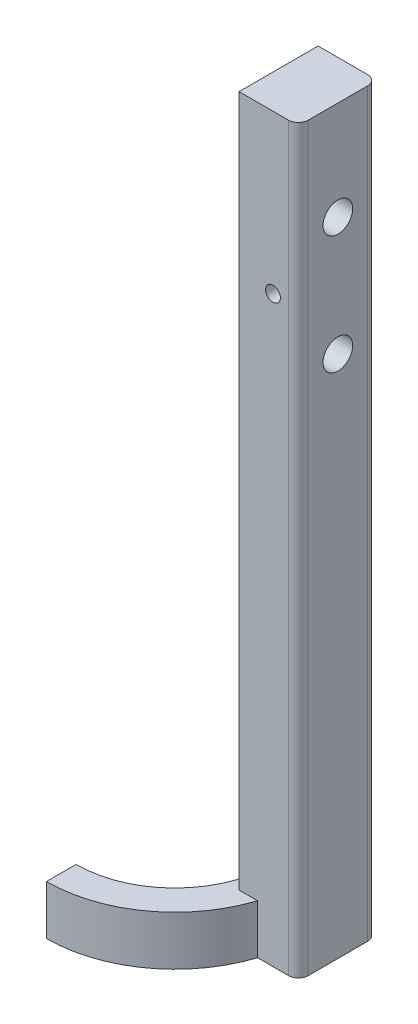
ISO-10303-21;
HEADER;
FILE_DESCRIPTION(('STEP AP214'),'2;1');
FILE_NAME('part.step','',(''),(''),'','','');
FILE_SCHEMA(('AUTOMOTIVE_DESIGN { 1 0 10303 214 1 1 1 1 }'));
ENDSEC;
DATA;
#1=APPLICATION_CONTEXT('core data for automotive mechanical design processes');
#2=APPLICATION_PROTOCOL_DEFINITION('international standard','automotive_design',2000,#1);
#3=PRODUCT_CONTEXT('',#1,'mechanical');
#4=PRODUCT('Part','Part','',(#3));
#5=PRODUCT_RELATED_PRODUCT_CATEGORY('part','',(#4));
#6=PRODUCT_DEFINITION_FORMATION('','',#4);
#7=PRODUCT_DEFINITION_CONTEXT('part definition',#1,'design');
#8=PRODUCT_DEFINITION('design','',#6,#7);
#9=PRODUCT_DEFINITION_SHAPE('','',#8);
#10=(LENGTH_UNIT() NAMED_UNIT(*) SI_UNIT(.MILLI.,.METRE.));
#11=(NAMED_UNIT(*) PLANE_ANGLE_UNIT() SI_UNIT($,.RADIAN.));
#12=(NAMED_UNIT(*) SI_UNIT($,.STERADIAN.) SOLID_ANGLE_UNIT());
#13=UNCERTAINTY_MEASURE_WITH_UNIT(LENGTH_MEASURE(1.E-05),#10,'distance_accuracy_value','');
#14=(GEOMETRIC_REPRESENTATION_CONTEXT(3) GLOBAL_UNCERTAINTY_ASSIGNED_CONTEXT((#13)) GLOBAL_UNIT_ASSIGNED_CONTEXT((#10,
#11,#12)) REPRESENTATION_CONTEXT('',''));
#15=CARTESIAN_POINT('',(0.,0.,0.));
#16=DIRECTION('',(0.,0.,1.));
#17=DIRECTION('',(1.,0.,0.));
#18=AXIS2_PLACEMENT_3D('',#15,#16,#17);
#19=CARTESIAN_POINT('',(0.,5.,0.));
#20=DIRECTION('',(0.,-1.,0.));
#21=DIRECTION('',(0.,0.,1.));
#22=AXIS2_PLACEMENT_3D('',#19,#20,#21);
#23=CYLINDRICAL_SURFACE('',#22,13.);
#24=DIRECTION('',(0.,-1.,0.));
#25=VECTOR('',#24,1.);
#26=CARTESIAN_POINT('',(12.369316876853,5.,4.));
#27=LINE('',#26,#25);
#28=CARTESIAN_POINT('',(12.369316876853,0.,4.));
#29=VERTEX_POINT('',#28);
#30=CARTESIAN_POINT('',(12.369316876853,5.,4.));
#31=VERTEX_POINT('',#30);
#32=EDGE_CURVE('E295',#29,#31,#27,.F.);
#33=ORIENTED_EDGE('',*,*,#32,.T.);
#34=CARTESIAN_POINT('',(0.,5.,0.));
#35=DIRECTION('',(0.,-1.,0.));
#36=DIRECTION('',(0.,0.,-1.));
#37=AXIS2_PLACEMENT_3D('',#34,#35,#36);
#38=CIRCLE('',#37,13.);
#39=CARTESIAN_POINT('',(0.,5.,13.));
#40=VERTEX_POINT('',#39);
#41=EDGE_CURVE('E160',#31,#40,#38,.T.);
#42=ORIENTED_EDGE('',*,*,#41,.T.);
#43=DIRECTION('',(0.,-1.,0.));
#44=VECTOR('',#43,1.);
#45=CARTESIAN_POINT('',(0.,5.,13.));
#46=LINE('',#45,#44);
#47=CARTESIAN_POINT('',(0.,0.,13.));
#48=VERTEX_POINT('',#47);
#49=EDGE_CURVE('E309',#40,#48,#46,.T.);
#50=ORIENTED_EDGE('',*,*,#49,.T.);
#51=CARTESIAN_POINT('',(0.,0.,0.));
#52=DIRECTION('',(0.,-1.,0.));
#53=DIRECTION('',(0.,0.,-1.));
#54=AXIS2_PLACEMENT_3D('',#51,#52,#53);
#55=CIRCLE('',#54,13.);
#56=EDGE_CURVE('E299',#29,#48,#55,.T.);
#57=ORIENTED_EDGE('',*,*,#56,.F.);
#58=EDGE_LOOP('',(#33,#42,#50,#57));
#59=FACE_BOUND('',#58,.T.);
#60=ADVANCED_FACE('F41',(#59),#23,.T.);
#61=DIRECTION('',(0.,-1.,0.));
#62=VECTOR('',#61,1.);
#63=CARTESIAN_POINT('',(12.369316876853,5.,-4.));
#64=LINE('',#63,#62);
#65=CARTESIAN_POINT('',(12.369316876853,5.,-4.));
#66=VERTEX_POINT('',#65);
#67=CARTESIAN_POINT('',(12.369316876853,0.,-4.));
#68=VERTEX_POINT('',#67);
#69=EDGE_CURVE('E283',#66,#68,#64,.T.);
#70=ORIENTED_EDGE('',*,*,#69,.T.);
#71=CARTESIAN_POINT('',(0.,0.,-13.));
#72=VERTEX_POINT('',#71);
#73=EDGE_CURVE('E166',#72,#68,#55,.T.);
#74=ORIENTED_EDGE('',*,*,#73,.F.);
#75=DIRECTION('',(0.,-1.,0.));
#76=VECTOR('',#75,1.);
#77=CARTESIAN_POINT('',(0.,5.,-13.));
#78=LINE('',#77,#76);
#79=CARTESIAN_POINT('',(0.,5.,-13.));
#80=VERTEX_POINT('',#79);
#81=EDGE_CURVE('E174',#80,#72,#78,.T.);
#82=ORIENTED_EDGE('',*,*,#81,.F.);
#83=EDGE_CURVE('E170',#80,#66,#38,.T.);
#84=ORIENTED_EDGE('',*,*,#83,.T.);
#85=EDGE_LOOP('',(#70,#74,#82,#84));
#86=FACE_BOUND('',#85,.T.);
#87=ADVANCED_FACE('F409',(#86),#23,.T.);
#88=CARTESIAN_POINT('',(0.,5.,0.));
#89=DIRECTION('',(0.,1.,0.));
#90=DIRECTION('',(0.,0.,-1.));
#91=AXIS2_PLACEMENT_3D('',#88,#89,#90);
#92=PLANE('',#91);
#93=DIRECTION('',(0.,0.,1.));
#94=VECTOR('',#93,1.);
#95=CARTESIAN_POINT('',(10.5,5.,0.));
#96=LINE('',#95,#94);
#97=CARTESIAN_POINT('',(10.5,5.,-4.));
#98=VERTEX_POINT('',#97);
#99=CARTESIAN_POINT('',(10.5,5.,4.));
#100=VERTEX_POINT('',#99);
#101=EDGE_CURVE('E287',#98,#100,#96,.T.);
#102=ORIENTED_EDGE('',*,*,#101,.F.);
#103=DIRECTION('',(-1.,0.,0.));
#104=VECTOR('',#103,1.);
#105=CARTESIAN_POINT('',(0.,5.,-4.));
#106=LINE('',#105,#104);
#107=EDGE_CURVE('E279',#66,#98,#106,.T.);
#108=ORIENTED_EDGE('',*,*,#107,.F.);
#109=ORIENTED_EDGE('',*,*,#83,.F.);
#110=DIRECTION('',(0.,0.,-1.));
#111=VECTOR('',#110,1.);
#112=CARTESIAN_POINT('',(0.,5.,-10.));
#113=LINE('',#112,#111);
#114=CARTESIAN_POINT('',(0.,5.,-10.));
#115=VERTEX_POINT('',#114);
#116=EDGE_CURVE('E171',#115,#80,#113,.T.);
#117=ORIENTED_EDGE('',*,*,#116,.F.);
#118=CARTESIAN_POINT('',(0.,5.,0.));
#119=DIRECTION('',(0.,-1.,0.));
#120=DIRECTION('',(0.,0.,-1.));
#121=AXIS2_PLACEMENT_3D('',#118,#119,#120);
#122=CIRCLE('',#121,10.);
#123=CARTESIAN_POINT('',(0.,5.,10.));
#124=VERTEX_POINT('',#123);
#125=EDGE_CURVE('E169',#124,#115,#122,.F.);
#126=ORIENTED_EDGE('',*,*,#125,.F.);
#127=DIRECTION('',(0.,0.,-1.));
#128=VECTOR('',#127,1.);
#129=CARTESIAN_POINT('',(0.,5.,13.));
#130=LINE('',#129,#128);
#131=EDGE_CURVE('E92',#40,#124,#130,.T.);
#132=ORIENTED_EDGE('',*,*,#131,.F.);
#133=ORIENTED_EDGE('',*,*,#41,.F.);
#134=DIRECTION('',(1.,0.,0.));
#135=VECTOR('',#134,1.);
#136=CARTESIAN_POINT('',(0.,5.,4.));
#137=LINE('',#136,#135);
#138=EDGE_CURVE('E291',#100,#31,#137,.T.);
#139=ORIENTED_EDGE('',*,*,#138,.F.);
#140=EDGE_LOOP('',(#102,#108,#109,#117,#126,#132,#133,#139));
#141=FACE_BOUND('',#140,.T.);
#142=ADVANCED_FACE('F346',(#141),#92,.T.);
#143=CARTESIAN_POINT('',(0.,5.,13.));
#144=DIRECTION('',(1.,0.,0.));
#145=DIRECTION('',(0.,0.,1.));
#146=AXIS2_PLACEMENT_3D('',#143,#144,#145);
#147=PLANE('',#146);
#148=DIRECTION('',(0.,-1.,0.));
#149=VECTOR('',#148,1.);
#150=CARTESIAN_POINT('',(0.,3.,8.5));
#151=LINE('',#150,#149);
#152=CARTESIAN_POINT('',(0.,3.,8.5));
#153=VERTEX_POINT('',#152);
#154=CARTESIAN_POINT('',(0.,2.,8.5));
#155=VERTEX_POINT('',#154);
#156=EDGE_CURVE('E186',#153,#155,#151,.T.);
#157=ORIENTED_EDGE('',*,*,#156,.T.);
#158=DIRECTION('',(0.,0.8,-0.6));
#159=VECTOR('',#158,1.);
#160=CARTESIAN_POINT('',(0.,0.,10.));
#161=LINE('',#160,#159);
#162=CARTESIAN_POINT('',(0.,0.,10.));
#163=VERTEX_POINT('',#162);
#164=EDGE_CURVE('E362',#163,#155,#161,.T.);
#165=ORIENTED_EDGE('',*,*,#164,.F.);
#166=DIRECTION('',(0.,0.,-1.));
#167=VECTOR('',#166,1.);
#168=CARTESIAN_POINT('',(0.,0.,13.));
#169=LINE('',#168,#167);
#170=EDGE_CURVE('E162',#48,#163,#169,.T.);
#171=ORIENTED_EDGE('',*,*,#170,.F.);
#172=ORIENTED_EDGE('',*,*,#49,.F.);
#173=ORIENTED_EDGE('',*,*,#131,.T.);
#174=DIRECTION('',(0.,-0.8,-0.6));
#175=VECTOR('',#174,1.);
#176=CARTESIAN_POINT('',(0.,5.,10.));
#177=LINE('',#176,#175);
#178=EDGE_CURVE('E83',#124,#153,#177,.T.);
#179=ORIENTED_EDGE('',*,*,#178,.T.);
#180=EDGE_LOOP('',(#157,#165,#171,#172,#173,#179));
#181=FACE_BOUND('',#180,.T.);
#182=ADVANCED_FACE('F399',(#181),#147,.F.);
#183=CARTESIAN_POINT('',(0.,5.,-10.));
#184=DIRECTION('',(1.,0.,0.));
#185=DIRECTION('',(0.,0.,1.));
#186=AXIS2_PLACEMENT_3D('',#183,#184,#185);
#187=PLANE('',#186);
#188=DIRECTION('',(0.,-0.8,0.6));
#189=VECTOR('',#188,1.);
#190=CARTESIAN_POINT('',(0.,5.,-10.));
#191=LINE('',#190,#189);
#192=CARTESIAN_POINT('',(0.,3.,-8.5));
#193=VERTEX_POINT('',#192);
#194=EDGE_CURVE('E353',#115,#193,#191,.T.);
#195=ORIENTED_EDGE('',*,*,#194,.F.);
#196=ORIENTED_EDGE('',*,*,#116,.T.);
#197=ORIENTED_EDGE('',*,*,#81,.T.);
#198=DIRECTION('',(0.,0.,-1.));
#199=VECTOR('',#198,1.);
#200=CARTESIAN_POINT('',(0.,0.,-10.));
#201=LINE('',#200,#199);
#202=CARTESIAN_POINT('',(0.,0.,-10.));
#203=VERTEX_POINT('',#202);
#204=EDGE_CURVE('E157',#203,#72,#201,.T.);
#205=ORIENTED_EDGE('',*,*,#204,.F.);
#206=DIRECTION('',(0.,0.8,0.6));
#207=VECTOR('',#206,1.);
#208=CARTESIAN_POINT('',(0.,0.,-10.));
#209=LINE('',#208,#207);
#210=CARTESIAN_POINT('',(0.,2.,-8.5));
#211=VERTEX_POINT('',#210);
#212=EDGE_CURVE('E356',#203,#211,#209,.T.);
#213=ORIENTED_EDGE('',*,*,#212,.T.);
#214=DIRECTION('',(0.,-1.,0.));
#215=VECTOR('',#214,1.);
#216=CARTESIAN_POINT('',(0.,3.,-8.5));
#217=LINE('',#216,#215);
#218=EDGE_CURVE('E179',#193,#211,#217,.T.);
#219=ORIENTED_EDGE('',*,*,#218,.F.);
#220=EDGE_LOOP('',(#195,#196,#197,#205,#213,#219));
#221=FACE_BOUND('',#220,.T.);
#222=ADVANCED_FACE('F404',(#221),#187,.F.);
#223=CARTESIAN_POINT('',(0.,0.,0.));
#224=DIRECTION('',(0.,1.,0.));
#225=DIRECTION('',(0.,0.,-1.));
#226=AXIS2_PLACEMENT_3D('',#223,#224,#225);
#227=PLANE('',#226);
#228=DIRECTION('',(-1.,0.,0.));
#229=VECTOR('',#228,1.);
#230=CARTESIAN_POINT('',(16.5,0.,4.));
#231=LINE('',#230,#229);
#232=CARTESIAN_POINT('',(15.5,0.,4.));
#233=VERTEX_POINT('',#232);
#234=EDGE_CURVE('E266',#233,#29,#231,.T.);
#235=ORIENTED_EDGE('',*,*,#234,.T.);
#236=ORIENTED_EDGE('',*,*,#56,.T.);
#237=ORIENTED_EDGE('',*,*,#170,.T.);
#238=CARTESIAN_POINT('',(0.,0.,0.));
#239=DIRECTION('',(0.,1.,0.));
#240=DIRECTION('',(0.,0.,1.));
#241=AXIS2_PLACEMENT_3D('',#238,#239,#240);
#242=CIRCLE('',#241,10.);
#243=EDGE_CURVE('E161',#163,#203,#242,.T.);
#244=ORIENTED_EDGE('',*,*,#243,.T.);
#245=ORIENTED_EDGE('',*,*,#204,.T.);
#246=ORIENTED_EDGE('',*,*,#73,.T.);
#247=DIRECTION('',(1.,0.,0.));
#248=VECTOR('',#247,1.);
#249=CARTESIAN_POINT('',(16.5,0.,-4.));
#250=LINE('',#249,#248);
#251=CARTESIAN_POINT('',(15.5,0.,-4.));
#252=VERTEX_POINT('',#251);
#253=EDGE_CURVE('E138',#68,#252,#250,.T.);
#254=ORIENTED_EDGE('',*,*,#253,.T.);
#255=CARTESIAN_POINT('',(15.5,0.,-3.));
#256=DIRECTION('',(0.,-1.,0.));
#257=DIRECTION('',(0.,0.,-1.));
#258=AXIS2_PLACEMENT_3D('',#255,#256,#257);
#259=CIRCLE('',#258,1.);
#260=CARTESIAN_POINT('',(16.5,0.,-3.));
#261=VERTEX_POINT('',#260);
#262=EDGE_CURVE('E151',#261,#252,#259,.F.);
#263=ORIENTED_EDGE('',*,*,#262,.F.);
#264=DIRECTION('',(0.,0.,1.));
#265=VECTOR('',#264,1.);
#266=CARTESIAN_POINT('',(16.5,0.,4.));
#267=LINE('',#266,#265);
#268=CARTESIAN_POINT('',(16.5,0.,3.));
#269=VERTEX_POINT('',#268);
#270=EDGE_CURVE('E142',#261,#269,#267,.T.);
#271=ORIENTED_EDGE('',*,*,#270,.T.);
#272=CARTESIAN_POINT('',(15.5,0.,3.));
#273=DIRECTION('',(0.,-1.,0.));
#274=DIRECTION('',(0.,0.,-1.));
#275=AXIS2_PLACEMENT_3D('',#272,#273,#274);
#276=CIRCLE('',#275,1.);
#277=EDGE_CURVE('E145',#233,#269,#276,.F.);
#278=ORIENTED_EDGE('',*,*,#277,.F.);
#279=EDGE_LOOP('',(#235,#236,#237,#244,#245,#246,#254,#263,#271,#278));
#280=FACE_BOUND('',#279,.T.);
#281=ADVANCED_FACE('F318',(#280),#227,.F.);
#282=CARTESIAN_POINT('',(16.5,75.,4.));
#283=DIRECTION('',(0.,0.,-1.));
#284=DIRECTION('',(1.,0.,0.));
#285=AXIS2_PLACEMENT_3D('',#282,#283,#284);
#286=PLANE('',#285);
#287=CARTESIAN_POINT('',(13.9346584384265,59.,4.));
#288=DIRECTION('',(0.,0.,1.));
#289=DIRECTION('',(1.,0.,0.));
#290=AXIS2_PLACEMENT_3D('',#287,#288,#289);
#291=CIRCLE('',#290,0.75);
#292=CARTESIAN_POINT('',(14.6846584384265,59.,4.));
#293=VERTEX_POINT('',#292);
#294=EDGE_CURVE('E366',#293,#293,#291,.T.);
#295=ORIENTED_EDGE('',*,*,#294,.F.);
#296=EDGE_LOOP('',(#295));
#297=FACE_BOUND('',#296,.T.);
#298=DIRECTION('',(-1.,0.,0.));
#299=VECTOR('',#298,1.);
#300=CARTESIAN_POINT('',(16.5,75.,4.));
#301=LINE('',#300,#299);
#302=CARTESIAN_POINT('',(15.5,75.,4.));
#303=VERTEX_POINT('',#302);
#304=CARTESIAN_POINT('',(10.5,75.,4.));
#305=VERTEX_POINT('',#304);
#306=EDGE_CURVE('E137',#303,#305,#301,.T.);
#307=ORIENTED_EDGE('',*,*,#306,.T.);
#308=DIRECTION('',(0.,-1.,0.));
#309=VECTOR('',#308,1.);
#310=CARTESIAN_POINT('',(10.5,75.,4.));
#311=LINE('',#310,#309);
#312=EDGE_CURVE('E275',#305,#100,#311,.T.);
#313=ORIENTED_EDGE('',*,*,#312,.T.);
#314=ORIENTED_EDGE('',*,*,#138,.T.);
#315=ORIENTED_EDGE('',*,*,#32,.F.);
#316=ORIENTED_EDGE('',*,*,#234,.F.);
#317=DIRECTION('',(0.,-1.,0.));
#318=VECTOR('',#317,1.);
#319=CARTESIAN_POINT('',(15.5,75.,4.));
#320=LINE('',#319,#318);
#321=EDGE_CURVE('E313',#303,#233,#320,.T.);
#322=ORIENTED_EDGE('',*,*,#321,.F.);
#323=EDGE_LOOP('',(#307,#313,#314,#315,#316,#322));
#324=FACE_BOUND('',#323,.T.);
#325=ADVANCED_FACE('F342',(#297,#324),#286,.F.);
#326=CARTESIAN_POINT('',(16.5,75.,-4.));
#327=DIRECTION('',(0.,0.,1.));
#328=DIRECTION('',(-1.,0.,0.));
#329=AXIS2_PLACEMENT_3D('',#326,#327,#328);
#330=PLANE('',#329);
#331=CARTESIAN_POINT('',(13.9346584384265,59.,-4.));
#332=DIRECTION('',(0.,0.,1.));
#333=DIRECTION('',(1.,0.,0.));
#334=AXIS2_PLACEMENT_3D('',#331,#332,#333);
#335=CIRCLE('',#334,0.75);
#336=CARTESIAN_POINT('',(14.6846584384265,59.,-4.));
#337=VERTEX_POINT('',#336);
#338=EDGE_CURVE('E370',#337,#337,#335,.T.);
#339=ORIENTED_EDGE('',*,*,#338,.T.);
#340=EDGE_LOOP('',(#339));
#341=FACE_BOUND('',#340,.T.);
#342=ORIENTED_EDGE('',*,*,#253,.F.);
#343=ORIENTED_EDGE('',*,*,#69,.F.);
#344=ORIENTED_EDGE('',*,*,#107,.T.);
#345=DIRECTION('',(0.,-1.,0.));
#346=VECTOR('',#345,1.);
#347=CARTESIAN_POINT('',(10.5,75.,-4.));
#348=LINE('',#347,#346);
#349=CARTESIAN_POINT('',(10.5,75.,-4.));
#350=VERTEX_POINT('',#349);
#351=EDGE_CURVE('E263',#350,#98,#348,.T.);
#352=ORIENTED_EDGE('',*,*,#351,.F.);
#353=DIRECTION('',(1.,0.,0.));
#354=VECTOR('',#353,1.);
#355=CARTESIAN_POINT('',(16.5,75.,-4.));
#356=LINE('',#355,#354);
#357=CARTESIAN_POINT('',(15.5,75.,-4.));
#358=VERTEX_POINT('',#357);
#359=EDGE_CURVE('E260',#350,#358,#356,.T.);
#360=ORIENTED_EDGE('',*,*,#359,.T.);
#361=DIRECTION('',(0.,-1.,0.));
#362=VECTOR('',#361,1.);
#363=CARTESIAN_POINT('',(15.5,75.,-4.));
#364=LINE('',#363,#362);
#365=EDGE_CURVE('E11',#252,#358,#364,.F.);
#366=ORIENTED_EDGE('',*,*,#365,.F.);
#367=EDGE_LOOP('',(#342,#343,#344,#352,#360,#366));
#368=FACE_BOUND('',#367,.T.);
#369=ADVANCED_FACE('F323',(#341,#368),#330,.F.);
#370=CARTESIAN_POINT('',(16.5,75.,4.));
#371=DIRECTION('',(-1.,0.,0.));
#372=DIRECTION('',(0.,0.,-1.));
#373=AXIS2_PLACEMENT_3D('',#370,#371,#372);
#374=PLANE('',#373);
#375=CARTESIAN_POINT('',(16.5,65.,0.));
#376=DIRECTION('',(1.,0.,0.));
#377=DIRECTION('',(0.,0.,-1.));
#378=AXIS2_PLACEMENT_3D('',#375,#376,#377);
#379=CIRCLE('',#378,1.5);
#380=CARTESIAN_POINT('',(16.5,65.,-1.5));
#381=VERTEX_POINT('',#380);
#382=EDGE_CURVE('E233',#381,#381,#379,.T.);
#383=ORIENTED_EDGE('',*,*,#382,.F.);
#384=EDGE_LOOP('',(#383));
#385=FACE_BOUND('',#384,.T.);
#386=CARTESIAN_POINT('',(16.5,53.,0.));
#387=DIRECTION('',(1.,0.,0.));
#388=DIRECTION('',(0.,0.,-1.));
#389=AXIS2_PLACEMENT_3D('',#386,#387,#388);
#390=CIRCLE('',#389,1.5);
#391=CARTESIAN_POINT('',(16.5,53.,-1.5));
#392=VERTEX_POINT('',#391);
#393=EDGE_CURVE('E246',#392,#392,#390,.T.);
#394=ORIENTED_EDGE('',*,*,#393,.F.);
#395=EDGE_LOOP('',(#394));
#396=FACE_BOUND('',#395,.T.);
#397=ORIENTED_EDGE('',*,*,#270,.F.);
#398=DIRECTION('',(0.,-1.,0.));
#399=VECTOR('',#398,1.);
#400=CARTESIAN_POINT('',(16.5,75.,-3.));
#401=LINE('',#400,#399);
#402=CARTESIAN_POINT('',(16.5,75.,-3.));
#403=VERTEX_POINT('',#402);
#404=EDGE_CURVE('E124',#403,#261,#401,.T.);
#405=ORIENTED_EDGE('',*,*,#404,.F.);
#406=DIRECTION('',(0.,0.,1.));
#407=VECTOR('',#406,1.);
#408=CARTESIAN_POINT('',(16.5,75.,4.));
#409=LINE('',#408,#407);
#410=CARTESIAN_POINT('',(16.5,75.,3.));
#411=VERTEX_POINT('',#410);
#412=EDGE_CURVE('E131',#403,#411,#409,.T.);
#413=ORIENTED_EDGE('',*,*,#412,.T.);
#414=DIRECTION('',(0.,-1.,0.));
#415=VECTOR('',#414,1.);
#416=CARTESIAN_POINT('',(16.5,75.,3.));
#417=LINE('',#416,#415);
#418=EDGE_CURVE('E128',#269,#411,#417,.F.);
#419=ORIENTED_EDGE('',*,*,#418,.F.);
#420=EDGE_LOOP('',(#397,#405,#413,#419));
#421=FACE_BOUND('',#420,.T.);
#422=ADVANCED_FACE('F140',(#385,#396,#421),#374,.F.);
#423=CARTESIAN_POINT('',(10.5,75.,4.));
#424=DIRECTION('',(1.,0.,0.));
#425=DIRECTION('',(0.,0.,1.));
#426=AXIS2_PLACEMENT_3D('',#423,#424,#425);
#427=PLANE('',#426);
#428=CARTESIAN_POINT('',(10.5,65.,0.));
#429=DIRECTION('',(1.,0.,0.));
#430=DIRECTION('',(0.,0.,-1.));
#431=AXIS2_PLACEMENT_3D('',#428,#429,#430);
#432=CIRCLE('',#431,1.5);
#433=CARTESIAN_POINT('',(10.5,65.,-1.5));
#434=VERTEX_POINT('',#433);
#435=EDGE_CURVE('E242',#434,#434,#432,.T.);
#436=ORIENTED_EDGE('',*,*,#435,.T.);
#437=EDGE_LOOP('',(#436));
#438=FACE_BOUND('',#437,.T.);
#439=CARTESIAN_POINT('',(10.5,53.,0.));
#440=DIRECTION('',(1.,0.,0.));
#441=DIRECTION('',(0.,0.,-1.));
#442=AXIS2_PLACEMENT_3D('',#439,#440,#441);
#443=CIRCLE('',#442,1.5);
#444=CARTESIAN_POINT('',(10.5,53.,-1.5));
#445=VERTEX_POINT('',#444);
#446=EDGE_CURVE('E190',#445,#445,#443,.T.);
#447=ORIENTED_EDGE('',*,*,#446,.T.);
#448=EDGE_LOOP('',(#447));
#449=FACE_BOUND('',#448,.T.);
#450=ORIENTED_EDGE('',*,*,#101,.T.);
#451=ORIENTED_EDGE('',*,*,#312,.F.);
#452=DIRECTION('',(0.,0.,-1.));
#453=VECTOR('',#452,1.);
#454=CARTESIAN_POINT('',(10.5,75.,4.));
#455=LINE('',#454,#453);
#456=EDGE_CURVE('E256',#305,#350,#455,.T.);
#457=ORIENTED_EDGE('',*,*,#456,.T.);
#458=ORIENTED_EDGE('',*,*,#351,.T.);
#459=EDGE_LOOP('',(#450,#451,#457,#458));
#460=FACE_BOUND('',#459,.T.);
#461=ADVANCED_FACE('F412',(#438,#449,#460),#427,.F.);
#462=CARTESIAN_POINT('',(0.,75.,0.));
#463=DIRECTION('',(0.,-1.,0.));
#464=DIRECTION('',(0.,0.,1.));
#465=AXIS2_PLACEMENT_3D('',#462,#463,#464);
#466=PLANE('',#465);
#467=ORIENTED_EDGE('',*,*,#412,.F.);
#468=CARTESIAN_POINT('',(15.5,75.,-3.));
#469=DIRECTION('',(0.,1.,0.));
#470=DIRECTION('',(0.,0.,1.));
#471=AXIS2_PLACEMENT_3D('',#468,#469,#470);
#472=CIRCLE('',#471,1.);
#473=EDGE_CURVE('E62',#358,#403,#472,.F.);
#474=ORIENTED_EDGE('',*,*,#473,.F.);
#475=ORIENTED_EDGE('',*,*,#359,.F.);
#476=ORIENTED_EDGE('',*,*,#456,.F.);
#477=ORIENTED_EDGE('',*,*,#306,.F.);
#478=CARTESIAN_POINT('',(15.5,75.,3.));
#479=DIRECTION('',(0.,1.,0.));
#480=DIRECTION('',(0.,0.,1.));
#481=AXIS2_PLACEMENT_3D('',#478,#479,#480);
#482=CIRCLE('',#481,1.);
#483=EDGE_CURVE('E53',#411,#303,#482,.F.);
#484=ORIENTED_EDGE('',*,*,#483,.F.);
#485=EDGE_LOOP('',(#467,#474,#475,#476,#477,#484));
#486=FACE_BOUND('',#485,.T.);
#487=ADVANCED_FACE('F132',(#486),#466,.F.);
#488=CARTESIAN_POINT('',(15.5,75.,3.));
#489=DIRECTION('',(0.,-1.,0.));
#490=DIRECTION('',(0.,0.,1.));
#491=AXIS2_PLACEMENT_3D('',#488,#489,#490);
#492=CYLINDRICAL_SURFACE('',#491,1.);
#493=ORIENTED_EDGE('',*,*,#483,.T.);
#494=ORIENTED_EDGE('',*,*,#321,.T.);
#495=ORIENTED_EDGE('',*,*,#277,.T.);
#496=ORIENTED_EDGE('',*,*,#418,.T.);
#497=EDGE_LOOP('',(#493,#494,#495,#496));
#498=FACE_BOUND('',#497,.T.);
#499=ADVANCED_FACE('F418',(#498),#492,.T.);
#500=CARTESIAN_POINT('',(15.5,75.,-3.));
#501=DIRECTION('',(0.,-1.,0.));
#502=DIRECTION('',(0.,0.,1.));
#503=AXIS2_PLACEMENT_3D('',#500,#501,#502);
#504=CYLINDRICAL_SURFACE('',#503,1.);
#505=ORIENTED_EDGE('',*,*,#473,.T.);
#506=ORIENTED_EDGE('',*,*,#404,.T.);
#507=ORIENTED_EDGE('',*,*,#262,.T.);
#508=ORIENTED_EDGE('',*,*,#365,.T.);
#509=EDGE_LOOP('',(#505,#506,#507,#508));
#510=FACE_BOUND('',#509,.T.);
#511=ADVANCED_FACE('F43',(#510),#504,.T.);
#512=CARTESIAN_POINT('',(16.5,53.,0.));
#513=DIRECTION('',(-1.,0.,0.));
#514=DIRECTION('',(0.,0.,-1.));
#515=AXIS2_PLACEMENT_3D('',#512,#513,#514);
#516=CYLINDRICAL_SURFACE('',#515,1.5);
#517=ORIENTED_EDGE('',*,*,#393,.T.);
#518=EDGE_LOOP('',(#517));
#519=FACE_BOUND('',#518,.T.);
#520=ORIENTED_EDGE('',*,*,#446,.F.);
#521=EDGE_LOOP('',(#520));
#522=FACE_BOUND('',#521,.T.);
#523=ADVANCED_FACE('F424',(#519,#522),#516,.F.);
#524=CARTESIAN_POINT('',(16.5,65.,0.));
#525=DIRECTION('',(-1.,0.,0.));
#526=DIRECTION('',(0.,0.,-1.));
#527=AXIS2_PLACEMENT_3D('',#524,#525,#526);
#528=CYLINDRICAL_SURFACE('',#527,1.5);
#529=ORIENTED_EDGE('',*,*,#382,.T.);
#530=EDGE_LOOP('',(#529));
#531=FACE_BOUND('',#530,.T.);
#532=ORIENTED_EDGE('',*,*,#435,.F.);
#533=EDGE_LOOP('',(#532));
#534=FACE_BOUND('',#533,.T.);
#535=ADVANCED_FACE('F225',(#531,#534),#528,.F.);
#536=CARTESIAN_POINT('',(0.,3.,0.));
#537=DIRECTION('',(0.,-1.,0.));
#538=DIRECTION('',(0.,0.,1.));
#539=AXIS2_PLACEMENT_3D('',#536,#537,#538);
#540=CYLINDRICAL_SURFACE('',#539,8.5);
#541=CARTESIAN_POINT('',(0.,2.,0.));
#542=DIRECTION('',(0.,1.,0.));
#543=DIRECTION('',(0.,0.,-1.));
#544=AXIS2_PLACEMENT_3D('',#541,#542,#543);
#545=CIRCLE('',#544,8.5);
#546=EDGE_CURVE('E45',#155,#211,#545,.T.);
#547=ORIENTED_EDGE('',*,*,#546,.F.);
#548=ORIENTED_EDGE('',*,*,#156,.F.);
#549=CARTESIAN_POINT('',(0.,3.,0.));
#550=DIRECTION('',(0.,1.,0.));
#551=DIRECTION('',(0.,0.,-1.));
#552=AXIS2_PLACEMENT_3D('',#549,#550,#551);
#553=CIRCLE('',#552,8.5);
#554=EDGE_CURVE('E183',#153,#193,#553,.T.);
#555=ORIENTED_EDGE('',*,*,#554,.T.);
#556=ORIENTED_EDGE('',*,*,#218,.T.);
#557=EDGE_LOOP('',(#547,#548,#555,#556));
#558=FACE_BOUND('',#557,.T.);
#559=ADVANCED_FACE('F214',(#558),#540,.F.);
#560=CARTESIAN_POINT('',(0.,5.,0.));
#561=DIRECTION('',(0.,1.,0.));
#562=DIRECTION('',(0.,0.,-1.));
#563=AXIS2_PLACEMENT_3D('',#560,#561,#562);
#564=CONICAL_SURFACE('',#563,10.,0.643501108793284);
#565=ORIENTED_EDGE('',*,*,#178,.F.);
#566=ORIENTED_EDGE('',*,*,#125,.T.);
#567=ORIENTED_EDGE('',*,*,#194,.T.);
#568=ORIENTED_EDGE('',*,*,#554,.F.);
#569=EDGE_LOOP('',(#565,#566,#567,#568));
#570=FACE_BOUND('',#569,.T.);
#571=ADVANCED_FACE('F224',(#570),#564,.F.);
#572=CARTESIAN_POINT('',(0.,0.,0.));
#573=DIRECTION('',(0.,-1.,0.));
#574=DIRECTION('',(0.,0.,1.));
#575=AXIS2_PLACEMENT_3D('',#572,#573,#574);
#576=CONICAL_SURFACE('',#575,10.,0.643501108793284);
#577=ORIENTED_EDGE('',*,*,#212,.F.);
#578=ORIENTED_EDGE('',*,*,#243,.F.);
#579=ORIENTED_EDGE('',*,*,#164,.T.);
#580=ORIENTED_EDGE('',*,*,#546,.T.);
#581=EDGE_LOOP('',(#577,#578,#579,#580));
#582=FACE_BOUND('',#581,.T.);
#583=ADVANCED_FACE('F226',(#582),#576,.F.);
#584=CARTESIAN_POINT('',(13.9346584384265,59.,13.));
#585=DIRECTION('',(0.,0.,-1.));
#586=DIRECTION('',(1.,0.,0.));
#587=AXIS2_PLACEMENT_3D('',#584,#585,#586);
#588=CYLINDRICAL_SURFACE('',#587,0.75);
#589=ORIENTED_EDGE('',*,*,#338,.F.);
#590=EDGE_LOOP('',(#589));
#591=FACE_BOUND('',#590,.T.);
#592=ORIENTED_EDGE('',*,*,#294,.T.);
#593=EDGE_LOOP('',(#592));
#594=FACE_BOUND('',#593,.T.);
#595=ADVANCED_FACE('F481',(#591,#594),#588,.F.);
#596=CLOSED_SHELL('',(#60,#87,#142,#182,#222,#281,#325,#369,#422,#461,#487,#499,#511,#523,#535,
#559,#571,#583,#595));
#597=MANIFOLD_SOLID_BREP('B2',#596);
#598=ADVANCED_BREP_SHAPE_REPRESENTATION('',(#18,#597),#14);
#599=SHAPE_DEFINITION_REPRESENTATION(#9,#598);
ENDSEC;
END-ISO-10303-21;
